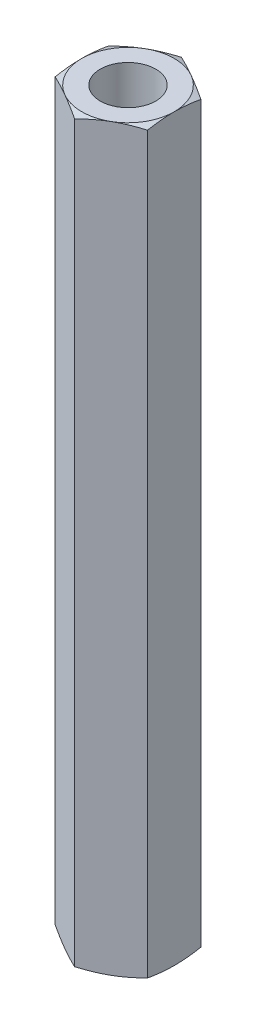
ISO-10303-21;
HEADER;
FILE_DESCRIPTION(('STEP AP214'),'2;1');
FILE_NAME('part.step','',(''),(''),'','','');
FILE_SCHEMA(('AUTOMOTIVE_DESIGN { 1 0 10303 214 1 1 1 1 }'));
ENDSEC;
DATA;
#1=APPLICATION_CONTEXT('core data for automotive mechanical design processes');
#2=APPLICATION_PROTOCOL_DEFINITION('international standard','automotive_design',2000,#1);
#3=PRODUCT_CONTEXT('',#1,'mechanical');
#4=PRODUCT('Part','Part','',(#3));
#5=PRODUCT_RELATED_PRODUCT_CATEGORY('part','',(#4));
#6=PRODUCT_DEFINITION_FORMATION('','',#4);
#7=PRODUCT_DEFINITION_CONTEXT('part definition',#1,'design');
#8=PRODUCT_DEFINITION('design','',#6,#7);
#9=PRODUCT_DEFINITION_SHAPE('','',#8);
#10=(LENGTH_UNIT() NAMED_UNIT(*) SI_UNIT(.MILLI.,.METRE.));
#11=(NAMED_UNIT(*) PLANE_ANGLE_UNIT() SI_UNIT($,.RADIAN.));
#12=(NAMED_UNIT(*) SI_UNIT($,.STERADIAN.) SOLID_ANGLE_UNIT());
#13=UNCERTAINTY_MEASURE_WITH_UNIT(LENGTH_MEASURE(1.E-05),#10,'distance_accuracy_value','');
#14=(GEOMETRIC_REPRESENTATION_CONTEXT(3) GLOBAL_UNCERTAINTY_ASSIGNED_CONTEXT((#13)) GLOBAL_UNIT_ASSIGNED_CONTEXT((#10,
#11,#12)) REPRESENTATION_CONTEXT('',''));
#15=CARTESIAN_POINT('',(0.,0.,0.));
#16=DIRECTION('',(0.,0.,1.));
#17=DIRECTION('',(1.,0.,0.));
#18=AXIS2_PLACEMENT_3D('',#15,#16,#17);
#19=CARTESIAN_POINT('',(0.,40.,0.));
#20=DIRECTION('',(0.,1.,0.));
#21=DIRECTION('',(0.,0.,1.));
#22=AXIS2_PLACEMENT_3D('',#19,#20,#21);
#23=PLANE('',#22);
#24=CARTESIAN_POINT('',(0.,40.,0.));
#25=DIRECTION('',(0.,-1.,0.));
#26=DIRECTION('',(0.,0.,-1.));
#27=AXIS2_PLACEMENT_3D('',#24,#25,#26);
#28=CIRCLE('',#27,2.5);
#29=CARTESIAN_POINT('',(-1.24999999999999,40.,2.1650635094611));
#30=VERTEX_POINT('',#29);
#31=CARTESIAN_POINT('',(-2.5,40.,0.));
#32=VERTEX_POINT('',#31);
#33=EDGE_CURVE('E348',#30,#32,#28,.T.);
#34=ORIENTED_EDGE('',*,*,#33,.F.);
#35=CARTESIAN_POINT('',(1.25000000000002,40.,2.16506350946109));
#36=VERTEX_POINT('',#35);
#37=EDGE_CURVE('E346',#36,#30,#28,.T.);
#38=ORIENTED_EDGE('',*,*,#37,.F.);
#39=CARTESIAN_POINT('',(2.5,40.,0.));
#40=VERTEX_POINT('',#39);
#41=EDGE_CURVE('E344',#40,#36,#28,.T.);
#42=ORIENTED_EDGE('',*,*,#41,.F.);
#43=CARTESIAN_POINT('',(1.24999999999999,40.,-2.16506350946111));
#44=VERTEX_POINT('',#43);
#45=EDGE_CURVE('E251',#44,#40,#28,.T.);
#46=ORIENTED_EDGE('',*,*,#45,.F.);
#47=CARTESIAN_POINT('',(-1.25,40.,-2.1650635094611));
#48=VERTEX_POINT('',#47);
#49=EDGE_CURVE('E347',#48,#44,#28,.T.);
#50=ORIENTED_EDGE('',*,*,#49,.F.);
#51=EDGE_CURVE('E352',#32,#48,#28,.T.);
#52=ORIENTED_EDGE('',*,*,#51,.F.);
#53=EDGE_LOOP('',(#34,#38,#42,#46,#50,#52));
#54=FACE_BOUND('',#53,.T.);
#55=CARTESIAN_POINT('',(0.,40.,0.));
#56=DIRECTION('',(0.,1.,0.));
#57=DIRECTION('',(0.,0.,1.));
#58=AXIS2_PLACEMENT_3D('',#55,#56,#57);
#59=CIRCLE('',#58,1.5);
#60=CARTESIAN_POINT('',(0.,40.,1.5));
#61=VERTEX_POINT('',#60);
#62=EDGE_CURVE('E314',#61,#61,#59,.T.);
#63=ORIENTED_EDGE('',*,*,#62,.F.);
#64=EDGE_LOOP('',(#63));
#65=FACE_BOUND('',#64,.T.);
#66=ADVANCED_FACE('F41',(#54,#65),#23,.T.);
#67=CARTESIAN_POINT('',(0.,0.,0.));
#68=DIRECTION('',(0.,1.,0.));
#69=DIRECTION('',(0.,0.,1.));
#70=AXIS2_PLACEMENT_3D('',#67,#68,#69);
#71=PLANE('',#70);
#72=CARTESIAN_POINT('',(0.,0.,0.));
#73=DIRECTION('',(0.,-1.,0.));
#74=DIRECTION('',(0.,0.,-1.));
#75=AXIS2_PLACEMENT_3D('',#72,#73,#74);
#76=CIRCLE('',#75,2.5);
#77=CARTESIAN_POINT('',(1.25000000000002,0.,2.16506350946109));
#78=VERTEX_POINT('',#77);
#79=CARTESIAN_POINT('',(-1.24999999999999,0.,2.1650635094611));
#80=VERTEX_POINT('',#79);
#81=EDGE_CURVE('E146',#78,#80,#76,.T.);
#82=ORIENTED_EDGE('',*,*,#81,.T.);
#83=CARTESIAN_POINT('',(-2.5,0.,0.));
#84=VERTEX_POINT('',#83);
#85=EDGE_CURVE('E169',#80,#84,#76,.T.);
#86=ORIENTED_EDGE('',*,*,#85,.T.);
#87=CARTESIAN_POINT('',(-1.25,0.,-2.1650635094611));
#88=VERTEX_POINT('',#87);
#89=EDGE_CURVE('E168',#84,#88,#76,.T.);
#90=ORIENTED_EDGE('',*,*,#89,.T.);
#91=CARTESIAN_POINT('',(1.24999999999999,0.,-2.16506350946111));
#92=VERTEX_POINT('',#91);
#93=EDGE_CURVE('E165',#88,#92,#76,.T.);
#94=ORIENTED_EDGE('',*,*,#93,.T.);
#95=CARTESIAN_POINT('',(2.5,0.,0.));
#96=VERTEX_POINT('',#95);
#97=EDGE_CURVE('E63',#92,#96,#76,.T.);
#98=ORIENTED_EDGE('',*,*,#97,.T.);
#99=EDGE_CURVE('E139',#96,#78,#76,.T.);
#100=ORIENTED_EDGE('',*,*,#99,.T.);
#101=EDGE_LOOP('',(#82,#86,#90,#94,#98,#100));
#102=FACE_BOUND('',#101,.T.);
#103=CARTESIAN_POINT('',(0.,0.,0.));
#104=DIRECTION('',(0.,1.,0.));
#105=DIRECTION('',(0.,0.,1.));
#106=AXIS2_PLACEMENT_3D('',#103,#104,#105);
#107=CIRCLE('',#106,1.5);
#108=CARTESIAN_POINT('',(0.,0.,1.5));
#109=VERTEX_POINT('',#108);
#110=EDGE_CURVE('E317',#109,#109,#107,.T.);
#111=ORIENTED_EDGE('',*,*,#110,.T.);
#112=EDGE_LOOP('',(#111));
#113=FACE_BOUND('',#112,.T.);
#114=ADVANCED_FACE('F162',(#102,#113),#71,.F.);
#115=CARTESIAN_POINT('',(2.49999999999998,40.,-1.44337567297409));
#116=DIRECTION('',(-0.499999999999995,0.,0.866025403784442));
#117=DIRECTION('',(0.866025403784442,0.,0.499999999999995));
#118=AXIS2_PLACEMENT_3D('',#115,#116,#117);
#119=PLANE('',#118);
#120=DIRECTION('',(0.,-1.,0.));
#121=VECTOR('',#120,1.);
#122=CARTESIAN_POINT('',(2.49999999999998,40.,-1.44337567297409));
#123=LINE('',#122,#121);
#124=CARTESIAN_POINT('',(2.49999999999999,39.8592340220125,-1.44337567297409));
#125=VERTEX_POINT('',#124);
#126=CARTESIAN_POINT('',(2.49999999999998,0.140765977987505,-1.44337567297409));
#127=VERTEX_POINT('',#126);
#128=EDGE_CURVE('E320',#125,#127,#123,.T.);
#129=ORIENTED_EDGE('',*,*,#128,.T.);
#130=CARTESIAN_POINT('',(2.50019999999998,0.14080800817161,-1.44326020292026));
#131=CARTESIAN_POINT('',(2.39665305132346,0.119039069131313,-1.50304306161241));
#132=CARTESIAN_POINT('',(2.29276461388714,0.0992363286997176,-1.56302307893196));
#133=CARTESIAN_POINT('',(2.08431213823202,0.0643963200817516,-1.68337317186468));
#134=CARTESIAN_POINT('',(1.97974763612162,0.0493627822141129,-1.7437435153058));
#135=CARTESIAN_POINT('',(1.77110364851345,0.0250464111610826,-1.86420417771618));
#136=CARTESIAN_POINT('',(1.6670289296066,0.0157105319226288,-1.92429174469288));
#137=CARTESIAN_POINT('',(1.45863606978594,0.00318847973073273,-2.04460741840753));
#138=CARTESIAN_POINT('',(1.35431803489297,0.,-2.10483546393432));
#139=CARTESIAN_POINT('',(1.14568196510702,0.,-2.2252915549879));
#140=CARTESIAN_POINT('',(1.04136393021405,0.00318847973073283,-2.28551960051469));
#141=CARTESIAN_POINT('',(0.832971070393384,0.0157105319226289,-2.40583527422935));
#142=CARTESIAN_POINT('',(0.728896351486535,0.0250464111610826,-2.46592284120605));
#143=CARTESIAN_POINT('',(0.520252363878367,0.0493627822141129,-2.58638350361642));
#144=CARTESIAN_POINT('',(0.41568786176796,0.0643963200817516,-2.64675384705754));
#145=CARTESIAN_POINT('',(0.207235386112848,0.0992363286997177,-2.76710393999026));
#146=CARTESIAN_POINT('',(0.103346948676526,0.119039069131314,-2.82708395730981));
#147=CARTESIAN_POINT('',(-0.000199999999999941,0.14080800817161,-2.88686681600197));
#148=B_SPLINE_CURVE_WITH_KNOTS('',3,(#130,#131,#132,#133,#134,#135,#136,#137,#138,#139,#140,
#141,#142,#143,#144,#145,#146,#147),.UNSPECIFIED.,.F.,.F.,(4,2,2,2,2,2,2,2,4),(0.,
0.364631406980055,0.729547317866326,1.09101180768958,1.45234063356534,1.8136694594411,
2.17513394926436,2.54004986015063,2.90468126713068),.UNSPECIFIED.);
#149=EDGE_CURVE('E151',#127,#92,#148,.T.);
#150=ORIENTED_EDGE('',*,*,#149,.T.);
#151=CARTESIAN_POINT('',(0.,0.140765977987505,-2.88675134594813));
#152=VERTEX_POINT('',#151);
#153=EDGE_CURVE('E359',#92,#152,#148,.T.);
#154=ORIENTED_EDGE('',*,*,#153,.T.);
#155=DIRECTION('',(0.,-1.,0.));
#156=VECTOR('',#155,1.);
#157=CARTESIAN_POINT('',(0.,40.,-2.88675134594813));
#158=LINE('',#157,#156);
#159=CARTESIAN_POINT('',(0.,39.8592340220125,-2.88675134594813));
#160=VERTEX_POINT('',#159);
#161=EDGE_CURVE('E330',#160,#152,#158,.T.);
#162=ORIENTED_EDGE('',*,*,#161,.F.);
#163=CARTESIAN_POINT('',(-0.0002,39.8591919918284,-2.88686681600197));
#164=CARTESIAN_POINT('',(0.103346948676527,39.8809609308687,-2.82708395730981));
#165=CARTESIAN_POINT('',(0.207235386112848,39.9007636713003,-2.76710393999026));
#166=CARTESIAN_POINT('',(0.41568786176796,39.9356036799182,-2.64675384705754));
#167=CARTESIAN_POINT('',(0.520252363878366,39.9506372177859,-2.58638350361642));
#168=CARTESIAN_POINT('',(0.728896351486535,39.9749535888389,-2.46592284120605));
#169=CARTESIAN_POINT('',(0.832971070393384,39.9842894680774,-2.40583527422935));
#170=CARTESIAN_POINT('',(1.04136393021405,39.9968115202693,-2.28551960051469));
#171=CARTESIAN_POINT('',(1.14568196510702,40.,-2.2252915549879));
#172=CARTESIAN_POINT('',(1.35431803489297,40.,-2.10483546393432));
#173=CARTESIAN_POINT('',(1.45863606978594,39.9968115202693,-2.04460741840753));
#174=CARTESIAN_POINT('',(1.6670289296066,39.9842894680774,-1.92429174469288));
#175=CARTESIAN_POINT('',(1.77110364851345,39.9749535888389,-1.86420417771618));
#176=CARTESIAN_POINT('',(1.97974763612162,39.9506372177859,-1.74374351530581));
#177=CARTESIAN_POINT('',(2.08431213823202,39.9356036799182,-1.68337317186468));
#178=CARTESIAN_POINT('',(2.29276461388714,39.9007636713003,-1.56302307893196));
#179=CARTESIAN_POINT('',(2.39665305132346,39.8809609308687,-1.50304306161241));
#180=CARTESIAN_POINT('',(2.50019999999998,39.8591919918284,-1.44326020292026));
#181=B_SPLINE_CURVE_WITH_KNOTS('',3,(#163,#164,#165,#166,#167,#168,#169,#170,#171,#172,#173,
#174,#175,#176,#177,#178,#179,#180),.UNSPECIFIED.,.F.,.F.,(4,2,2,2,2,2,2,2,4),(0.,
0.364631406980055,0.729547317866325,1.09101180768958,1.45234063356534,1.8136694594411,
2.17513394926436,2.54004986015063,2.90468126713068),.UNSPECIFIED.);
#182=EDGE_CURVE('E259',#160,#44,#181,.T.);
#183=ORIENTED_EDGE('',*,*,#182,.T.);
#184=EDGE_CURVE('E250',#44,#125,#181,.T.);
#185=ORIENTED_EDGE('',*,*,#184,.T.);
#186=EDGE_LOOP('',(#129,#150,#154,#162,#183,#185));
#187=FACE_BOUND('',#186,.T.);
#188=ADVANCED_FACE('F43',(#187),#119,.F.);
#189=CARTESIAN_POINT('',(0.,40.,-2.88675134594813));
#190=DIRECTION('',(0.500000000000001,0.,0.866025403784438));
#191=DIRECTION('',(0.866025403784438,0.,-0.500000000000001));
#192=AXIS2_PLACEMENT_3D('',#189,#190,#191);
#193=PLANE('',#192);
#194=ORIENTED_EDGE('',*,*,#161,.T.);
#195=CARTESIAN_POINT('',(0.000200000000000055,0.14080800817161,-2.88686681600197));
#196=CARTESIAN_POINT('',(-0.103346948676527,0.119039069131313,-2.82708395730981));
#197=CARTESIAN_POINT('',(-0.207235386112849,0.0992363286997167,-2.76710393999026));
#198=CARTESIAN_POINT('',(-0.415687861767963,0.0643963200817497,-2.64675384705754));
#199=CARTESIAN_POINT('',(-0.520252363878371,0.0493627822141106,-2.58638350361641));
#200=CARTESIAN_POINT('',(-0.728896351486541,0.0250464111610796,-2.46592284120604));
#201=CARTESIAN_POINT('',(-0.832971070393391,0.0157105319226256,-2.40583527422933));
#202=CARTESIAN_POINT('',(-1.04136393021405,0.00318847973072922,-2.28551960051468));
#203=CARTESIAN_POINT('',(-1.14568196510703,0.,-2.22529155498789));
#204=CARTESIAN_POINT('',(-1.35431803489298,0.,-2.1048354639343));
#205=CARTESIAN_POINT('',(-1.45863606978595,0.00318847973072929,-2.04460741840751));
#206=CARTESIAN_POINT('',(-1.66702892960661,0.0157105319226257,-1.92429174469286));
#207=CARTESIAN_POINT('',(-1.77110364851346,0.0250464111610797,-1.86420417771615));
#208=CARTESIAN_POINT('',(-1.97974763612163,0.0493627822141106,-1.74374351530578));
#209=CARTESIAN_POINT('',(-2.08431213823204,0.0643963200817495,-1.68337317186465));
#210=CARTESIAN_POINT('',(-2.29276461388716,0.0992363286997165,-1.56302307893193));
#211=CARTESIAN_POINT('',(-2.39665305132348,0.119039069131313,-1.50304306161238));
#212=CARTESIAN_POINT('',(-2.5002,0.14080800817161,-1.44326020292022));
#213=B_SPLINE_CURVE_WITH_KNOTS('',3,(#195,#196,#197,#198,#199,#200,#201,#202,#203,#204,#205,
#206,#207,#208,#209,#210,#211,#212),.UNSPECIFIED.,.F.,.F.,(4,2,2,2,2,2,2,2,4),(0.,
0.364631406980059,0.729547317866335,1.0910118076896,1.45234063356536,1.81366945944112,
2.17513394926439,2.54004986015066,2.90468126713072),.UNSPECIFIED.);
#214=EDGE_CURVE('E197',#152,#88,#213,.T.);
#215=ORIENTED_EDGE('',*,*,#214,.T.);
#216=CARTESIAN_POINT('',(-2.5,0.140765977987505,-1.44337567297406));
#217=VERTEX_POINT('',#216);
#218=EDGE_CURVE('E196',#88,#217,#213,.T.);
#219=ORIENTED_EDGE('',*,*,#218,.T.);
#220=DIRECTION('',(0.,-1.,0.));
#221=VECTOR('',#220,1.);
#222=CARTESIAN_POINT('',(-2.5,40.,-1.44337567297406));
#223=LINE('',#222,#221);
#224=CARTESIAN_POINT('',(-2.5,39.8592340220125,-1.44337567297406));
#225=VERTEX_POINT('',#224);
#226=EDGE_CURVE('E192',#225,#217,#223,.T.);
#227=ORIENTED_EDGE('',*,*,#226,.F.);
#228=CARTESIAN_POINT('',(-2.5002,39.8591919918284,-1.44326020292022));
#229=CARTESIAN_POINT('',(-2.39665305132348,39.8809609308687,-1.50304306161238));
#230=CARTESIAN_POINT('',(-2.29276461388716,39.9007636713003,-1.56302307893193));
#231=CARTESIAN_POINT('',(-2.08431213823204,39.9356036799182,-1.68337317186465));
#232=CARTESIAN_POINT('',(-1.97974763612163,39.9506372177859,-1.74374351530578));
#233=CARTESIAN_POINT('',(-1.77110364851346,39.9749535888389,-1.86420417771615));
#234=CARTESIAN_POINT('',(-1.66702892960661,39.9842894680774,-1.92429174469286));
#235=CARTESIAN_POINT('',(-1.45863606978595,39.9968115202693,-2.04460741840751));
#236=CARTESIAN_POINT('',(-1.35431803489298,40.,-2.1048354639343));
#237=CARTESIAN_POINT('',(-1.14568196510703,40.,-2.22529155498789));
#238=CARTESIAN_POINT('',(-1.04136393021405,39.9968115202693,-2.28551960051468));
#239=CARTESIAN_POINT('',(-0.832971070393392,39.9842894680774,-2.40583527422933));
#240=CARTESIAN_POINT('',(-0.728896351486542,39.9749535888389,-2.46592284120604));
#241=CARTESIAN_POINT('',(-0.520252363878372,39.9506372177859,-2.58638350361641));
#242=CARTESIAN_POINT('',(-0.415687861767964,39.9356036799182,-2.64675384705754));
#243=CARTESIAN_POINT('',(-0.20723538611285,39.9007636713003,-2.76710393999026));
#244=CARTESIAN_POINT('',(-0.103346948676528,39.8809609308687,-2.82708395730981));
#245=CARTESIAN_POINT('',(0.000199999999999277,39.8591919918284,-2.88686681600197));
#246=B_SPLINE_CURVE_WITH_KNOTS('',3,(#228,#229,#230,#231,#232,#233,#234,#235,#236,#237,#238,
#239,#240,#241,#242,#243,#244,#245),.UNSPECIFIED.,.F.,.F.,(4,2,2,2,2,2,2,2,4),(0.,
0.364631406980059,0.729547317866334,1.09101180768959,1.45234063356536,1.81366945944112,
2.17513394926438,2.54004986015066,2.90468126713072),.UNSPECIFIED.);
#247=EDGE_CURVE('E275',#225,#48,#246,.T.);
#248=ORIENTED_EDGE('',*,*,#247,.T.);
#249=EDGE_CURVE('E267',#48,#160,#246,.T.);
#250=ORIENTED_EDGE('',*,*,#249,.T.);
#251=EDGE_LOOP('',(#194,#215,#219,#227,#248,#250));
#252=FACE_BOUND('',#251,.T.);
#253=ADVANCED_FACE('F282',(#252),#193,.F.);
#254=CARTESIAN_POINT('',(-2.5,40.,-1.44337567297406));
#255=DIRECTION('',(1.,0.,0.));
#256=DIRECTION('',(0.,0.,-1.));
#257=AXIS2_PLACEMENT_3D('',#254,#255,#256);
#258=PLANE('',#257);
#259=ORIENTED_EDGE('',*,*,#226,.T.);
#260=CARTESIAN_POINT('',(-2.50000000000001,0.911069918498277,-4.33375705030873));
#261=CARTESIAN_POINT('',(-2.50000000000001,0.857151962741801,-4.1626121487893));
#262=CARTESIAN_POINT('',(-2.50000000000001,0.803889247670831,-3.99125292656233));
#263=CARTESIAN_POINT('',(-2.50000000000001,0.69930335640862,-3.64790122960469));
#264=CARTESIAN_POINT('',(-2.50000000000001,0.647980635713833,-3.4759086164341));
#265=CARTESIAN_POINT('',(-2.50000000000001,0.547192255797185,-3.12862476065279));
#266=CARTESIAN_POINT('',(-2.50000000000001,0.497765115102502,-2.95332226186821));
#267=CARTESIAN_POINT('',(-2.50000000000001,0.402640277745607,-2.60170577064682));
#268=CARTESIAN_POINT('',(-2.50000000000001,0.356942439150233,-2.42539181697849));
#269=CARTESIAN_POINT('',(-2.50000000000001,0.272638394402228,-2.07901596617797));
#270=CARTESIAN_POINT('',(-2.50000000000001,0.23381285721516,-1.90900813322593));
#271=CARTESIAN_POINT('',(-2.50000000000001,0.162867038370275,-1.56755699875978));
#272=CARTESIAN_POINT('',(-2.5,0.130747206656134,-1.39611360172355));
#273=CARTESIAN_POINT('',(-2.5,0.0758518227791602,-1.0530624452063));
#274=CARTESIAN_POINT('',(-2.5,0.0530056159219143,-0.88146630977827));
#275=CARTESIAN_POINT('',(-2.5,0.0188225697475227,-0.53712766793483));
#276=CARTESIAN_POINT('',(-2.5,0.00748169084071901,-0.364385585324842));
#277=CARTESIAN_POINT('',(-2.5,4.41044611636465E-05,-0.0973938847142259));
#278=CARTESIAN_POINT('',(-2.5,-0.000644888189889868,-0.00325681931252066));
#279=CARTESIAN_POINT('',(-2.5,0.00184631107398493,0.184970103743224));
#280=CARTESIAN_POINT('',(-2.5,0.00502655264592554,0.279059960775897));
#281=CARTESIAN_POINT('',(-2.5,0.015123951884491,0.467060430735629));
#282=CARTESIAN_POINT('',(-2.5,0.0220420903773809,0.560970990121307));
#283=CARTESIAN_POINT('',(-2.5,0.0393313521905073,0.748477331015654));
#284=CARTESIAN_POINT('',(-2.5,0.0497028075871465,0.842073081377142));
#285=CARTESIAN_POINT('',(-2.5,0.0856400575240554,1.12380926395698));
#286=CARTESIAN_POINT('',(-2.5,0.11593467680529,1.31134961033422));
#287=CARTESIAN_POINT('',(-2.49999999999999,0.185757521056657,1.68464568549852));
#288=CARTESIAN_POINT('',(-2.49999999999999,0.225286525445452,1.87040126226532));
#289=CARTESIAN_POINT('',(-2.49999999999999,0.312868160934005,2.24929384309453));
#290=CARTESIAN_POINT('',(-2.49999999999999,0.36123931401971,2.4423561495298));
#291=CARTESIAN_POINT('',(-2.49999999999999,0.462845732200083,2.82717406569174));
#292=CARTESIAN_POINT('',(-2.49999999999999,0.516080908992444,3.01892969907208));
#293=CARTESIAN_POINT('',(-2.49999999999999,0.625017863722862,3.39827826743582));
#294=CARTESIAN_POINT('',(-2.49999999999999,0.680663797121237,3.58588734311867));
#295=CARTESIAN_POINT('',(-2.49999999999999,0.765880720880494,3.86673968266629));
#296=CARTESIAN_POINT('',(-2.49999999999999,0.794573796432827,3.96025127643636));
#297=CARTESIAN_POINT('',(-2.49999999999999,0.852463883475543,4.14711653548762));
#298=CARTESIAN_POINT('',(-2.49999999999999,0.881660885655833,4.24047020365159));
#299=CARTESIAN_POINT('',(-2.49999999999999,0.911069918498278,4.33375705030875));
#300=B_SPLINE_CURVE_WITH_KNOTS('',3,(#260,#261,#262,#263,#264,#265,#266,#267,#268,#269,#270,
#271,#272,#273,#274,#275,#276,#277,#278,#279,#280,#281,#282,#283,#284,#285,#286,#287,#288,#289,
#290,#291,#292,#293,#294,#295,#296,#297,#298,#299),.UNSPECIFIED.,.F.,.F.,(4,2,2,2,2,2,2,2,2,2,2,
2,2,2,2,2,2,2,2,4),(0.,0.538321778022813,1.07676917474352,1.62315243554882,2.16951489189724,
2.69257527905732,3.21567075158288,3.73470243407144,4.25355181828768,4.53589900114569,
4.8182498076317,5.10067473913607,5.38312683691478,5.95267633652759,6.52227392575277,
7.11926798158169,7.71625120163245,8.30329216687821,8.59673518713048,8.89017279178625),.UNSPECIFIED.);
#301=EDGE_CURVE('E186',#217,#84,#300,.T.);
#302=ORIENTED_EDGE('',*,*,#301,.T.);
#303=CARTESIAN_POINT('',(-2.49999999999999,0.140765977987505,1.44337567297408));
#304=VERTEX_POINT('',#303);
#305=EDGE_CURVE('E182',#84,#304,#300,.T.);
#306=ORIENTED_EDGE('',*,*,#305,.T.);
#307=DIRECTION('',(0.,-1.,0.));
#308=VECTOR('',#307,1.);
#309=CARTESIAN_POINT('',(-2.5,40.,1.44337567297408));
#310=LINE('',#309,#308);
#311=CARTESIAN_POINT('',(-2.49999999999999,39.8592340220125,1.44337567297408));
#312=VERTEX_POINT('',#311);
#313=EDGE_CURVE('E327',#312,#304,#310,.T.);
#314=ORIENTED_EDGE('',*,*,#313,.F.);
#315=CARTESIAN_POINT('',(-2.49999999999999,39.0889300815017,4.33375705030875));
#316=CARTESIAN_POINT('',(-2.49999999999999,39.1428480372582,4.16261214878932));
#317=CARTESIAN_POINT('',(-2.49999999999999,39.1961107523292,3.99125292656234));
#318=CARTESIAN_POINT('',(-2.49999999999999,39.3006966435914,3.64790122960471));
#319=CARTESIAN_POINT('',(-2.49999999999999,39.3520193642862,3.47590861643411));
#320=CARTESIAN_POINT('',(-2.49999999999999,39.4528077442028,3.12862476065281));
#321=CARTESIAN_POINT('',(-2.49999999999999,39.5022348848975,2.95332226186823));
#322=CARTESIAN_POINT('',(-2.49999999999999,39.5973597222544,2.60170577064684));
#323=CARTESIAN_POINT('',(-2.49999999999999,39.6430575608498,2.4253918169785));
#324=CARTESIAN_POINT('',(-2.49999999999999,39.7273616055978,2.07901596617799));
#325=CARTESIAN_POINT('',(-2.49999999999999,39.7661871427848,1.90900813322594));
#326=CARTESIAN_POINT('',(-2.49999999999999,39.8371329616297,1.56755699875979));
#327=CARTESIAN_POINT('',(-2.5,39.8692527933439,1.39611360172357));
#328=CARTESIAN_POINT('',(-2.5,39.9241481772208,1.05306244520632));
#329=CARTESIAN_POINT('',(-2.5,39.9469943840781,0.881466309778286));
#330=CARTESIAN_POINT('',(-2.5,39.9811774302525,0.537127667934846));
#331=CARTESIAN_POINT('',(-2.5,39.9925183091593,0.364385585324858));
#332=CARTESIAN_POINT('',(-2.5,39.9999558955388,0.0973938847142422));
#333=CARTESIAN_POINT('',(-2.5,40.0006448881899,0.00325681931253692));
#334=CARTESIAN_POINT('',(-2.5,39.998153688926,-0.184970103743208));
#335=CARTESIAN_POINT('',(-2.5,39.9949734473541,-0.279059960775881));
#336=CARTESIAN_POINT('',(-2.5,39.9848760481155,-0.467060430735612));
#337=CARTESIAN_POINT('',(-2.5,39.9779579096226,-0.560970990121291));
#338=CARTESIAN_POINT('',(-2.5,39.9606686478095,-0.748477331015638));
#339=CARTESIAN_POINT('',(-2.5,39.9502971924129,-0.842073081377125));
#340=CARTESIAN_POINT('',(-2.5,39.9143599424759,-1.12380926395697));
#341=CARTESIAN_POINT('',(-2.5,39.8840653231947,-1.31134961033421));
#342=CARTESIAN_POINT('',(-2.50000000000001,39.8142424789433,-1.6846456854985));
#343=CARTESIAN_POINT('',(-2.50000000000001,39.7747134745546,-1.8704012622653));
#344=CARTESIAN_POINT('',(-2.50000000000001,39.687131839066,-2.24929384309451));
#345=CARTESIAN_POINT('',(-2.50000000000001,39.6387606859803,-2.44235614952978));
#346=CARTESIAN_POINT('',(-2.50000000000001,39.5371542677999,-2.82717406569172));
#347=CARTESIAN_POINT('',(-2.50000000000001,39.4839190910076,-3.01892969907207));
#348=CARTESIAN_POINT('',(-2.50000000000001,39.3749821362771,-3.3982782674358));
#349=CARTESIAN_POINT('',(-2.50000000000001,39.3193362028788,-3.58588734311865));
#350=CARTESIAN_POINT('',(-2.50000000000001,39.2341192791195,-3.86673968266628));
#351=CARTESIAN_POINT('',(-2.50000000000001,39.2054262035672,-3.96025127643635));
#352=CARTESIAN_POINT('',(-2.50000000000001,39.1475361165245,-4.14711653548761));
#353=CARTESIAN_POINT('',(-2.50000000000001,39.1183391143442,-4.24047020365157));
#354=CARTESIAN_POINT('',(-2.50000000000001,39.0889300815017,-4.33375705030873));
#355=B_SPLINE_CURVE_WITH_KNOTS('',3,(#315,#316,#317,#318,#319,#320,#321,#322,#323,#324,#325,
#326,#327,#328,#329,#330,#331,#332,#333,#334,#335,#336,#337,#338,#339,#340,#341,#342,#343,#344,
#345,#346,#347,#348,#349,#350,#351,#352,#353,#354),.UNSPECIFIED.,.F.,.F.,(4,2,2,2,2,2,2,2,2,2,2,
2,2,2,2,2,2,2,2,4),(0.,0.538321778022814,1.07676917474352,1.62315243554882,2.16951489189725,
2.69257527905732,3.21567075158288,3.73470243407144,4.25355181828768,4.5358990011457,
4.8182498076317,5.10067473913607,5.38312683691478,5.95267633652759,6.52227392575277,
7.11926798158169,7.71625120163245,8.30329216687821,8.59673518713048,8.89017279178626),.UNSPECIFIED.);
#356=EDGE_CURVE('E318',#312,#32,#355,.T.);
#357=ORIENTED_EDGE('',*,*,#356,.T.);
#358=EDGE_CURVE('E276',#32,#225,#355,.T.);
#359=ORIENTED_EDGE('',*,*,#358,.T.);
#360=EDGE_LOOP('',(#259,#302,#306,#314,#357,#359));
#361=FACE_BOUND('',#360,.T.);
#362=ADVANCED_FACE('F189',(#361),#258,.F.);
#363=CARTESIAN_POINT('',(-2.5,40.,1.44337567297408));
#364=DIRECTION('',(0.499999999999995,0.,-0.866025403784442));
#365=DIRECTION('',(-0.866025403784442,0.,-0.499999999999995));
#366=AXIS2_PLACEMENT_3D('',#363,#364,#365);
#367=PLANE('',#366);
#368=ORIENTED_EDGE('',*,*,#313,.T.);
#369=CARTESIAN_POINT('',(-2.5002,0.14080800817161,1.44326020292024));
#370=CARTESIAN_POINT('',(-2.39665305132347,0.119039069131313,1.5030430616124));
#371=CARTESIAN_POINT('',(-2.29276461388715,0.0992363286997166,1.56302307893195));
#372=CARTESIAN_POINT('',(-2.08431213823203,0.0643963200817496,1.68337317186467));
#373=CARTESIAN_POINT('',(-1.97974763612162,0.0493627822141106,1.74374351530579));
#374=CARTESIAN_POINT('',(-1.77110364851345,0.0250464111610797,1.86420417771616));
#375=CARTESIAN_POINT('',(-1.6670289296066,0.0157105319226256,1.92429174469287));
#376=CARTESIAN_POINT('',(-1.45863606978594,0.00318847973072918,2.04460741840752));
#377=CARTESIAN_POINT('',(-1.35431803489296,0.,2.10483546393431));
#378=CARTESIAN_POINT('',(-1.14568196510701,0.,2.22529155498789));
#379=CARTESIAN_POINT('',(-1.04136393021404,0.00318847973072904,2.28551960051469));
#380=CARTESIAN_POINT('',(-0.832971070393375,0.0157105319226254,2.40583527422934));
#381=CARTESIAN_POINT('',(-0.728896351486524,0.0250464111610795,2.46592284120604));
#382=CARTESIAN_POINT('',(-0.520252363878353,0.0493627822141103,2.58638350361642));
#383=CARTESIAN_POINT('',(-0.415687861767946,0.0643963200817493,2.64675384705754));
#384=CARTESIAN_POINT('',(-0.207235386112831,0.0992363286997162,2.76710393999026));
#385=CARTESIAN_POINT('',(-0.103346948676508,0.119039069131313,2.82708395730981));
#386=CARTESIAN_POINT('',(0.000200000000019787,0.140808008171609,2.88686681600197));
#387=B_SPLINE_CURVE_WITH_KNOTS('',3,(#369,#370,#371,#372,#373,#374,#375,#376,#377,#378,#379,
#380,#381,#382,#383,#384,#385,#386),.UNSPECIFIED.,.F.,.F.,(4,2,2,2,2,2,2,2,4),(0.,
0.36463140698006,0.729547317866335,1.0910118076896,1.45234063356536,1.81366945944112,
2.17513394926439,2.54004986015066,2.90468126713072),.UNSPECIFIED.);
#388=EDGE_CURVE('E71',#304,#80,#387,.T.);
#389=ORIENTED_EDGE('',*,*,#388,.T.);
#390=CARTESIAN_POINT('',(0.,0.140765977987505,2.88675134594813));
#391=VERTEX_POINT('',#390);
#392=EDGE_CURVE('E174',#80,#391,#387,.T.);
#393=ORIENTED_EDGE('',*,*,#392,.T.);
#394=DIRECTION('',(0.,-1.,0.));
#395=VECTOR('',#394,1.);
#396=CARTESIAN_POINT('',(0.,40.,2.88675134594813));
#397=LINE('',#396,#395);
#398=CARTESIAN_POINT('',(0.,39.8592340220125,2.88675134594813));
#399=VERTEX_POINT('',#398);
#400=EDGE_CURVE('E325',#399,#391,#397,.T.);
#401=ORIENTED_EDGE('',*,*,#400,.F.);
#402=CARTESIAN_POINT('',(0.000200000000020158,39.8591919918284,2.88686681600197));
#403=CARTESIAN_POINT('',(-0.103346948676508,39.8809609308687,2.82708395730981));
#404=CARTESIAN_POINT('',(-0.20723538611283,39.9007636713003,2.76710393999026));
#405=CARTESIAN_POINT('',(-0.415687861767945,39.9356036799182,2.64675384705754));
#406=CARTESIAN_POINT('',(-0.520252363878354,39.9506372177859,2.58638350361642));
#407=CARTESIAN_POINT('',(-0.728896351486524,39.9749535888389,2.46592284120604));
#408=CARTESIAN_POINT('',(-0.832971070393375,39.9842894680774,2.40583527422934));
#409=CARTESIAN_POINT('',(-1.04136393021404,39.9968115202693,2.28551960051469));
#410=CARTESIAN_POINT('',(-1.14568196510701,40.,2.22529155498789));
#411=CARTESIAN_POINT('',(-1.35431803489296,40.,2.10483546393431));
#412=CARTESIAN_POINT('',(-1.45863606978594,39.9968115202693,2.04460741840752));
#413=CARTESIAN_POINT('',(-1.6670289296066,39.9842894680774,1.92429174469287));
#414=CARTESIAN_POINT('',(-1.77110364851345,39.9749535888389,1.86420417771616));
#415=CARTESIAN_POINT('',(-1.97974763612162,39.9506372177859,1.74374351530579));
#416=CARTESIAN_POINT('',(-2.08431213823203,39.9356036799182,1.68337317186467));
#417=CARTESIAN_POINT('',(-2.29276461388714,39.9007636713003,1.56302307893195));
#418=CARTESIAN_POINT('',(-2.39665305132347,39.8809609308687,1.5030430616124));
#419=CARTESIAN_POINT('',(-2.5002,39.8591919918284,1.44326020292024));
#420=B_SPLINE_CURVE_WITH_KNOTS('',3,(#402,#403,#404,#405,#406,#407,#408,#409,#410,#411,#412,
#413,#414,#415,#416,#417,#418,#419),.UNSPECIFIED.,.F.,.F.,(4,2,2,2,2,2,2,2,4),(0.,
0.36463140698006,0.729547317866335,1.0910118076896,1.45234063356536,1.81366945944112,
2.17513394926439,2.54004986015066,2.90468126713072),.UNSPECIFIED.);
#421=EDGE_CURVE('E260',#399,#30,#420,.T.);
#422=ORIENTED_EDGE('',*,*,#421,.T.);
#423=EDGE_CURVE('E268',#30,#312,#420,.T.);
#424=ORIENTED_EDGE('',*,*,#423,.T.);
#425=EDGE_LOOP('',(#368,#389,#393,#401,#422,#424));
#426=FACE_BOUND('',#425,.T.);
#427=ADVANCED_FACE('F236',(#426),#367,.F.);
#428=CARTESIAN_POINT('',(0.,40.,2.88675134594813));
#429=DIRECTION('',(-0.500000000000007,0.,-0.866025403784435));
#430=DIRECTION('',(-0.866025403784435,0.,0.500000000000007));
#431=AXIS2_PLACEMENT_3D('',#428,#429,#430);
#432=PLANE('',#431);
#433=ORIENTED_EDGE('',*,*,#400,.T.);
#434=CARTESIAN_POINT('',(-0.000199999999979897,0.14080800817161,2.88686681600197));
#435=CARTESIAN_POINT('',(0.103346948676547,0.119039069131313,2.82708395730981));
#436=CARTESIAN_POINT('',(0.207235386112869,0.0992363286997163,2.76710393999026));
#437=CARTESIAN_POINT('',(0.415687861767982,0.0643963200817494,2.64675384705753));
#438=CARTESIAN_POINT('',(0.520252363878389,0.0493627822141105,2.58638350361641));
#439=CARTESIAN_POINT('',(0.728896351486559,0.0250464111610796,2.46592284120603));
#440=CARTESIAN_POINT('',(0.832971070393408,0.0157105319226254,2.40583527422933));
#441=CARTESIAN_POINT('',(1.04136393021407,0.00318847973072907,2.28551960051467));
#442=CARTESIAN_POINT('',(1.14568196510704,0.,2.22529155498788));
#443=CARTESIAN_POINT('',(1.35431803489299,0.,2.10483546393429));
#444=CARTESIAN_POINT('',(1.45863606978597,0.00318847973072909,2.0446074184075));
#445=CARTESIAN_POINT('',(1.66702892960663,0.0157105319226255,1.92429174469284));
#446=CARTESIAN_POINT('',(1.77110364851348,0.0250464111610796,1.86420417771614));
#447=CARTESIAN_POINT('',(1.97974763612165,0.0493627822141107,1.74374351530576));
#448=CARTESIAN_POINT('',(2.08431213823205,0.0643963200817498,1.68337317186464));
#449=CARTESIAN_POINT('',(2.29276461388717,0.0992363286997168,1.56302307893191));
#450=CARTESIAN_POINT('',(2.39665305132349,0.119039069131313,1.50304306161236));
#451=CARTESIAN_POINT('',(2.50020000000002,0.14080800817161,1.4432602029202));
#452=B_SPLINE_CURVE_WITH_KNOTS('',3,(#434,#435,#436,#437,#438,#439,#440,#441,#442,#443,#444,
#445,#446,#447,#448,#449,#450,#451),.UNSPECIFIED.,.F.,.F.,(4,2,2,2,2,2,2,2,4),(0.,
0.36463140698006,0.729547317866335,1.0910118076896,1.45234063356536,1.81366945944112,
2.17513394926439,2.54004986015066,2.90468126713072),.UNSPECIFIED.);
#453=EDGE_CURVE('E166',#391,#78,#452,.T.);
#454=ORIENTED_EDGE('',*,*,#453,.T.);
#455=CARTESIAN_POINT('',(2.50000000000002,0.140765977987505,1.44337567297404));
#456=VERTEX_POINT('',#455);
#457=EDGE_CURVE('E142',#78,#456,#452,.T.);
#458=ORIENTED_EDGE('',*,*,#457,.T.);
#459=DIRECTION('',(0.,-1.,0.));
#460=VECTOR('',#459,1.);
#461=CARTESIAN_POINT('',(2.50000000000002,40.,1.44337567297404));
#462=LINE('',#461,#460);
#463=CARTESIAN_POINT('',(2.50000000000002,39.8592340220125,1.44337567297404));
#464=VERTEX_POINT('',#463);
#465=EDGE_CURVE('E160',#464,#456,#462,.T.);
#466=ORIENTED_EDGE('',*,*,#465,.F.);
#467=CARTESIAN_POINT('',(2.50020000000002,39.8591919918284,1.4432602029202));
#468=CARTESIAN_POINT('',(2.39665305132349,39.8809609308687,1.50304306161236));
#469=CARTESIAN_POINT('',(2.29276461388717,39.9007636713003,1.56302307893191));
#470=CARTESIAN_POINT('',(2.08431213823205,39.9356036799182,1.68337317186464));
#471=CARTESIAN_POINT('',(1.97974763612165,39.9506372177859,1.74374351530576));
#472=CARTESIAN_POINT('',(1.77110364851348,39.9749535888389,1.86420417771614));
#473=CARTESIAN_POINT('',(1.66702892960663,39.9842894680774,1.92429174469284));
#474=CARTESIAN_POINT('',(1.45863606978597,39.9968115202693,2.0446074184075));
#475=CARTESIAN_POINT('',(1.35431803489299,40.,2.10483546393429));
#476=CARTESIAN_POINT('',(1.14568196510704,40.,2.22529155498788));
#477=CARTESIAN_POINT('',(1.04136393021407,39.9968115202693,2.28551960051467));
#478=CARTESIAN_POINT('',(0.832971070393409,39.9842894680774,2.40583527422933));
#479=CARTESIAN_POINT('',(0.728896351486559,39.9749535888389,2.46592284120603));
#480=CARTESIAN_POINT('',(0.52025236387839,39.9506372177859,2.58638350361641));
#481=CARTESIAN_POINT('',(0.415687861767983,39.9356036799182,2.64675384705753));
#482=CARTESIAN_POINT('',(0.20723538611287,39.9007636713003,2.76710393999026));
#483=CARTESIAN_POINT('',(0.103346948676548,39.8809609308687,2.82708395730981));
#484=CARTESIAN_POINT('',(-0.000199999999978832,39.8591919918284,2.88686681600197));
#485=B_SPLINE_CURVE_WITH_KNOTS('',3,(#467,#468,#469,#470,#471,#472,#473,#474,#475,#476,#477,
#478,#479,#480,#481,#482,#483,#484),.UNSPECIFIED.,.F.,.F.,(4,2,2,2,2,2,2,2,4),(0.,
0.36463140698006,0.729547317866334,1.09101180768959,1.45234063356536,1.81366945944112,
2.17513394926438,2.54004986015066,2.90468126713072),.UNSPECIFIED.);
#486=EDGE_CURVE('E243',#464,#36,#485,.T.);
#487=ORIENTED_EDGE('',*,*,#486,.T.);
#488=EDGE_CURVE('E252',#36,#399,#485,.T.);
#489=ORIENTED_EDGE('',*,*,#488,.T.);
#490=EDGE_LOOP('',(#433,#454,#458,#466,#487,#489));
#491=FACE_BOUND('',#490,.T.);
#492=ADVANCED_FACE('F233',(#491),#432,.F.);
#493=CARTESIAN_POINT('',(2.50000000000002,40.,1.44337567297404));
#494=DIRECTION('',(-1.,0.,0.));
#495=DIRECTION('',(0.,0.,1.));
#496=AXIS2_PLACEMENT_3D('',#493,#494,#495);
#497=PLANE('',#496);
#498=ORIENTED_EDGE('',*,*,#465,.T.);
#499=CARTESIAN_POINT('',(2.50000000000005,0.911069918498278,4.33375705030872));
#500=CARTESIAN_POINT('',(2.50000000000004,0.857151962741801,4.16261214878928));
#501=CARTESIAN_POINT('',(2.50000000000004,0.803889247670831,3.99125292656231));
#502=CARTESIAN_POINT('',(2.50000000000004,0.69930335640862,3.64790122960467));
#503=CARTESIAN_POINT('',(2.50000000000004,0.647980635713833,3.47590861643408));
#504=CARTESIAN_POINT('',(2.50000000000003,0.547192255797186,3.12862476065277));
#505=CARTESIAN_POINT('',(2.50000000000003,0.497765115102503,2.95332226186819));
#506=CARTESIAN_POINT('',(2.50000000000003,0.402640277745607,2.6017057706468));
#507=CARTESIAN_POINT('',(2.50000000000003,0.356942439150233,2.42539181697847));
#508=CARTESIAN_POINT('',(2.50000000000002,0.272638394402228,2.07901596617795));
#509=CARTESIAN_POINT('',(2.50000000000002,0.23381285721516,1.90900813322591));
#510=CARTESIAN_POINT('',(2.50000000000002,0.162867038370275,1.56755699875976));
#511=CARTESIAN_POINT('',(2.50000000000001,0.130747206656134,1.39611360172353));
#512=CARTESIAN_POINT('',(2.50000000000001,0.0758518227791601,1.05306244520628));
#513=CARTESIAN_POINT('',(2.50000000000001,0.0530056159219141,0.881466309778251));
#514=CARTESIAN_POINT('',(2.50000000000001,0.0188225697475226,0.53712766793481));
#515=CARTESIAN_POINT('',(2.5,0.00748169084071898,0.364385585324823));
#516=CARTESIAN_POINT('',(2.5,4.41044611637007E-05,0.0973938847142067));
#517=CARTESIAN_POINT('',(2.5,-0.000644888189889805,0.00325681931250134));
#518=CARTESIAN_POINT('',(2.5,0.00184631107398502,-0.184970103743244));
#519=CARTESIAN_POINT('',(2.5,0.00502655264592565,-0.279059960775917));
#520=CARTESIAN_POINT('',(2.5,0.0151239518844912,-0.467060430735648));
#521=CARTESIAN_POINT('',(2.49999999999999,0.0220420903773811,-0.560970990121327));
#522=CARTESIAN_POINT('',(2.49999999999999,0.0393313521905075,-0.748477331015674));
#523=CARTESIAN_POINT('',(2.49999999999999,0.0497028075871467,-0.842073081377161));
#524=CARTESIAN_POINT('',(2.49999999999999,0.0856400575240556,-1.123809263957));
#525=CARTESIAN_POINT('',(2.49999999999999,0.11593467680529,-1.31134961033424));
#526=CARTESIAN_POINT('',(2.49999999999998,0.185757521056657,-1.68464568549854));
#527=CARTESIAN_POINT('',(2.49999999999998,0.225286525445452,-1.87040126226534));
#528=CARTESIAN_POINT('',(2.49999999999998,0.312868160934005,-2.24929384309455));
#529=CARTESIAN_POINT('',(2.49999999999997,0.36123931401971,-2.44235614952982));
#530=CARTESIAN_POINT('',(2.49999999999997,0.462845732200083,-2.82717406569176));
#531=CARTESIAN_POINT('',(2.49999999999997,0.516080908992445,-3.0189296990721));
#532=CARTESIAN_POINT('',(2.49999999999996,0.625017863722862,-3.39827826743584));
#533=CARTESIAN_POINT('',(2.49999999999996,0.680663797121237,-3.58588734311868));
#534=CARTESIAN_POINT('',(2.49999999999996,0.765880720880494,-3.86673968266631));
#535=CARTESIAN_POINT('',(2.49999999999996,0.794573796432827,-3.96025127643638));
#536=CARTESIAN_POINT('',(2.49999999999996,0.852463883475543,-4.14711653548764));
#537=CARTESIAN_POINT('',(2.49999999999996,0.881660885655833,-4.24047020365161));
#538=CARTESIAN_POINT('',(2.49999999999995,0.911069918498278,-4.33375705030877));
#539=B_SPLINE_CURVE_WITH_KNOTS('',3,(#499,#500,#501,#502,#503,#504,#505,#506,#507,#508,#509,
#510,#511,#512,#513,#514,#515,#516,#517,#518,#519,#520,#521,#522,#523,#524,#525,#526,#527,#528,
#529,#530,#531,#532,#533,#534,#535,#536,#537,#538),.UNSPECIFIED.,.F.,.F.,(4,2,2,2,2,2,2,2,2,2,2,
2,2,2,2,2,2,2,2,4),(0.,0.538321778022814,1.07676917474352,1.62315243554882,2.16951489189725,
2.69257527905732,3.21567075158288,3.73470243407144,4.25355181828768,4.5358990011457,
4.8182498076317,5.10067473913607,5.38312683691478,5.95267633652759,6.52227392575277,
7.11926798158169,7.71625120163245,8.30329216687821,8.59673518713048,8.89017279178626),.UNSPECIFIED.);
#540=EDGE_CURVE('E11',#456,#96,#539,.T.);
#541=ORIENTED_EDGE('',*,*,#540,.T.);
#542=EDGE_CURVE('E46',#96,#127,#539,.T.);
#543=ORIENTED_EDGE('',*,*,#542,.T.);
#544=ORIENTED_EDGE('',*,*,#128,.F.);
#545=CARTESIAN_POINT('',(2.49999999999995,39.0889300815017,-4.33375705030877));
#546=CARTESIAN_POINT('',(2.49999999999996,39.1428480372582,-4.16261214878933));
#547=CARTESIAN_POINT('',(2.49999999999996,39.1961107523292,-3.99125292656236));
#548=CARTESIAN_POINT('',(2.49999999999996,39.3006966435914,-3.64790122960473));
#549=CARTESIAN_POINT('',(2.49999999999996,39.3520193642862,-3.47590861643413));
#550=CARTESIAN_POINT('',(2.49999999999997,39.4528077442028,-3.12862476065283));
#551=CARTESIAN_POINT('',(2.49999999999997,39.5022348848975,-2.95332226186825));
#552=CARTESIAN_POINT('',(2.49999999999997,39.5973597222544,-2.60170577064686));
#553=CARTESIAN_POINT('',(2.49999999999997,39.6430575608498,-2.42539181697852));
#554=CARTESIAN_POINT('',(2.49999999999998,39.7273616055978,-2.07901596617801));
#555=CARTESIAN_POINT('',(2.49999999999998,39.7661871427848,-1.90900813322596));
#556=CARTESIAN_POINT('',(2.49999999999998,39.8371329616297,-1.56755699875981));
#557=CARTESIAN_POINT('',(2.49999999999999,39.8692527933439,-1.39611360172359));
#558=CARTESIAN_POINT('',(2.49999999999999,39.9241481772208,-1.05306244520634));
#559=CARTESIAN_POINT('',(2.49999999999999,39.9469943840781,-0.881466309778305));
#560=CARTESIAN_POINT('',(2.49999999999999,39.9811774302525,-0.537127667934866));
#561=CARTESIAN_POINT('',(2.5,39.9925183091593,-0.364385585324877));
#562=CARTESIAN_POINT('',(2.5,39.9999558955388,-0.0973938847142616));
#563=CARTESIAN_POINT('',(2.5,40.0006448881899,-0.00325681931255663));
#564=CARTESIAN_POINT('',(2.5,39.998153688926,0.184970103743188));
#565=CARTESIAN_POINT('',(2.5,39.9949734473541,0.279059960775861));
#566=CARTESIAN_POINT('',(2.5,39.9848760481155,0.467060430735591));
#567=CARTESIAN_POINT('',(2.50000000000001,39.9779579096226,0.56097099012127));
#568=CARTESIAN_POINT('',(2.50000000000001,39.9606686478095,0.748477331015617));
#569=CARTESIAN_POINT('',(2.50000000000001,39.9502971924129,0.842073081377104));
#570=CARTESIAN_POINT('',(2.50000000000001,39.9143599424759,1.12380926395695));
#571=CARTESIAN_POINT('',(2.50000000000001,39.8840653231947,1.31134961033419));
#572=CARTESIAN_POINT('',(2.50000000000002,39.8142424789433,1.68464568549848));
#573=CARTESIAN_POINT('',(2.50000000000002,39.7747134745546,1.87040126226528));
#574=CARTESIAN_POINT('',(2.50000000000002,39.687131839066,2.24929384309449));
#575=CARTESIAN_POINT('',(2.50000000000003,39.6387606859803,2.44235614952976));
#576=CARTESIAN_POINT('',(2.50000000000003,39.5371542677999,2.8271740656917));
#577=CARTESIAN_POINT('',(2.50000000000003,39.4839190910076,3.01892969907205));
#578=CARTESIAN_POINT('',(2.50000000000004,39.3749821362771,3.39827826743578));
#579=CARTESIAN_POINT('',(2.50000000000004,39.3193362028788,3.58588734311863));
#580=CARTESIAN_POINT('',(2.50000000000004,39.2341192791195,3.86673968266626));
#581=CARTESIAN_POINT('',(2.50000000000004,39.2054262035672,3.96025127643633));
#582=CARTESIAN_POINT('',(2.50000000000004,39.1475361165245,4.14711653548759));
#583=CARTESIAN_POINT('',(2.50000000000004,39.1183391143442,4.24047020365156));
#584=CARTESIAN_POINT('',(2.50000000000005,39.0889300815017,4.33375705030872));
#585=B_SPLINE_CURVE_WITH_KNOTS('',3,(#545,#546,#547,#548,#549,#550,#551,#552,#553,#554,#555,
#556,#557,#558,#559,#560,#561,#562,#563,#564,#565,#566,#567,#568,#569,#570,#571,#572,#573,#574,
#575,#576,#577,#578,#579,#580,#581,#582,#583,#584),.UNSPECIFIED.,.F.,.F.,(4,2,2,2,2,2,2,2,2,2,2,
2,2,2,2,2,2,2,2,4),(0.,0.538321778022815,1.07676917474352,1.62315243554882,2.16951489189725,
2.69257527905732,3.21567075158288,3.73470243407144,4.25355181828768,4.53589900114569,
4.8182498076317,5.10067473913607,5.38312683691478,5.95267633652759,6.52227392575277,
7.11926798158169,7.71625120163245,8.30329216687821,8.59673518713048,8.89017279178626),.UNSPECIFIED.);
#586=EDGE_CURVE('E155',#125,#40,#585,.T.);
#587=ORIENTED_EDGE('',*,*,#586,.T.);
#588=EDGE_CURVE('E331',#40,#464,#585,.T.);
#589=ORIENTED_EDGE('',*,*,#588,.T.);
#590=EDGE_LOOP('',(#498,#541,#543,#544,#587,#589));
#591=FACE_BOUND('',#590,.T.);
#592=ADVANCED_FACE('F157',(#591),#497,.F.);
#593=CARTESIAN_POINT('',(0.,40.,0.));
#594=DIRECTION('',(0.,-1.,0.));
#595=DIRECTION('',(0.,0.,-1.));
#596=AXIS2_PLACEMENT_3D('',#593,#594,#595);
#597=CYLINDRICAL_SURFACE('',#596,1.5);
#598=ORIENTED_EDGE('',*,*,#62,.T.);
#599=EDGE_LOOP('',(#598));
#600=FACE_BOUND('',#599,.T.);
#601=ORIENTED_EDGE('',*,*,#110,.F.);
#602=EDGE_LOOP('',(#601));
#603=FACE_BOUND('',#602,.T.);
#604=ADVANCED_FACE('F303',(#600,#603),#597,.F.);
#605=CARTESIAN_POINT('',(0.,40.,0.));
#606=DIRECTION('',(0.,-1.,0.));
#607=DIRECTION('',(0.,0.,-1.));
#608=AXIS2_PLACEMENT_3D('',#605,#606,#607);
#609=CONICAL_SURFACE('',#608,2.5,1.22173047639604);
#610=ORIENTED_EDGE('',*,*,#588,.F.);
#611=ORIENTED_EDGE('',*,*,#41,.T.);
#612=ORIENTED_EDGE('',*,*,#486,.F.);
#613=EDGE_LOOP('',(#610,#611,#612));
#614=FACE_BOUND('',#613,.T.);
#615=ADVANCED_FACE('F304',(#614),#609,.T.);
#616=ORIENTED_EDGE('',*,*,#45,.T.);
#617=ORIENTED_EDGE('',*,*,#586,.F.);
#618=ORIENTED_EDGE('',*,*,#184,.F.);
#619=EDGE_LOOP('',(#616,#617,#618));
#620=FACE_BOUND('',#619,.T.);
#621=ADVANCED_FACE('F308',(#620),#609,.T.);
#622=ORIENTED_EDGE('',*,*,#488,.F.);
#623=ORIENTED_EDGE('',*,*,#37,.T.);
#624=ORIENTED_EDGE('',*,*,#421,.F.);
#625=EDGE_LOOP('',(#622,#623,#624));
#626=FACE_BOUND('',#625,.T.);
#627=ADVANCED_FACE('F422',(#626),#609,.T.);
#628=ORIENTED_EDGE('',*,*,#423,.F.);
#629=ORIENTED_EDGE('',*,*,#33,.T.);
#630=ORIENTED_EDGE('',*,*,#356,.F.);
#631=EDGE_LOOP('',(#628,#629,#630));
#632=FACE_BOUND('',#631,.T.);
#633=ADVANCED_FACE('F220',(#632),#609,.T.);
#634=ORIENTED_EDGE('',*,*,#51,.T.);
#635=ORIENTED_EDGE('',*,*,#247,.F.);
#636=ORIENTED_EDGE('',*,*,#358,.F.);
#637=EDGE_LOOP('',(#634,#635,#636));
#638=FACE_BOUND('',#637,.T.);
#639=ADVANCED_FACE('F421',(#638),#609,.T.);
#640=ORIENTED_EDGE('',*,*,#49,.T.);
#641=ORIENTED_EDGE('',*,*,#182,.F.);
#642=ORIENTED_EDGE('',*,*,#249,.F.);
#643=EDGE_LOOP('',(#640,#641,#642));
#644=FACE_BOUND('',#643,.T.);
#645=ADVANCED_FACE('F218',(#644),#609,.T.);
#646=CARTESIAN_POINT('',(0.,0.,0.));
#647=DIRECTION('',(0.,1.,0.));
#648=DIRECTION('',(0.,0.,-1.));
#649=AXIS2_PLACEMENT_3D('',#646,#647,#648);
#650=CONICAL_SURFACE('',#649,2.5,1.22173047639604);
#651=ORIENTED_EDGE('',*,*,#542,.F.);
#652=ORIENTED_EDGE('',*,*,#97,.F.);
#653=ORIENTED_EDGE('',*,*,#149,.F.);
#654=EDGE_LOOP('',(#651,#652,#653));
#655=FACE_BOUND('',#654,.T.);
#656=ADVANCED_FACE('F149',(#655),#650,.T.);
#657=ORIENTED_EDGE('',*,*,#99,.F.);
#658=ORIENTED_EDGE('',*,*,#540,.F.);
#659=ORIENTED_EDGE('',*,*,#457,.F.);
#660=EDGE_LOOP('',(#657,#658,#659));
#661=FACE_BOUND('',#660,.T.);
#662=ADVANCED_FACE('F140',(#661),#650,.T.);
#663=ORIENTED_EDGE('',*,*,#81,.F.);
#664=ORIENTED_EDGE('',*,*,#453,.F.);
#665=ORIENTED_EDGE('',*,*,#392,.F.);
#666=EDGE_LOOP('',(#663,#664,#665));
#667=FACE_BOUND('',#666,.T.);
#668=ADVANCED_FACE('F173',(#667),#650,.T.);
#669=ORIENTED_EDGE('',*,*,#85,.F.);
#670=ORIENTED_EDGE('',*,*,#388,.F.);
#671=ORIENTED_EDGE('',*,*,#305,.F.);
#672=EDGE_LOOP('',(#669,#670,#671));
#673=FACE_BOUND('',#672,.T.);
#674=ADVANCED_FACE('F180',(#673),#650,.T.);
#675=ORIENTED_EDGE('',*,*,#89,.F.);
#676=ORIENTED_EDGE('',*,*,#301,.F.);
#677=ORIENTED_EDGE('',*,*,#218,.F.);
#678=EDGE_LOOP('',(#675,#676,#677));
#679=FACE_BOUND('',#678,.T.);
#680=ADVANCED_FACE('F368',(#679),#650,.T.);
#681=ORIENTED_EDGE('',*,*,#93,.F.);
#682=ORIENTED_EDGE('',*,*,#214,.F.);
#683=ORIENTED_EDGE('',*,*,#153,.F.);
#684=EDGE_LOOP('',(#681,#682,#683));
#685=FACE_BOUND('',#684,.T.);
#686=ADVANCED_FACE('F219',(#685),#650,.T.);
#687=CLOSED_SHELL('',(#66,#114,#188,#253,#362,#427,#492,#592,#604,#615,#621,#627,#633,#639,#645,
#656,#662,#668,#674,#680,#686));
#688=MANIFOLD_SOLID_BREP('B2',#687);
#689=ADVANCED_BREP_SHAPE_REPRESENTATION('',(#18,#688),#14);
#690=SHAPE_DEFINITION_REPRESENTATION(#9,#689);
ENDSEC;
END-ISO-10303-21;
